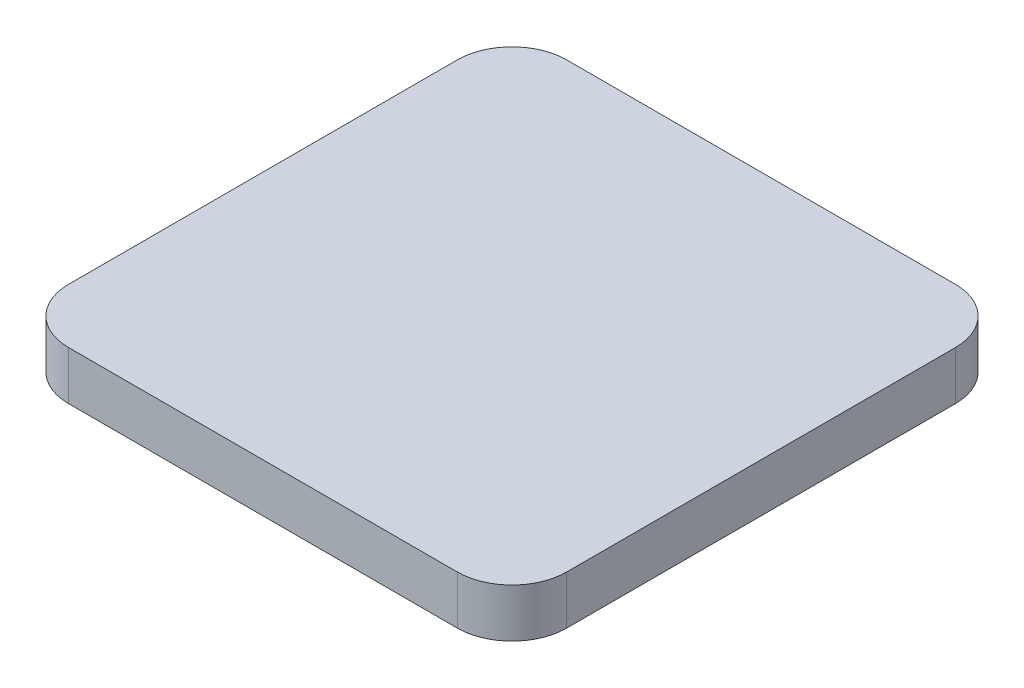
ISO-10303-21;
HEADER;
FILE_DESCRIPTION(('STEP AP214'),'2;1');
FILE_NAME('part.step','',(''),(''),'','','');
FILE_SCHEMA(('AUTOMOTIVE_DESIGN { 1 0 10303 214 1 1 1 1 }'));
ENDSEC;
DATA;
#1=APPLICATION_CONTEXT('core data for automotive mechanical design processes');
#2=APPLICATION_PROTOCOL_DEFINITION('international standard','automotive_design',2000,#1);
#3=PRODUCT_CONTEXT('',#1,'mechanical');
#4=PRODUCT('Part','Part','',(#3));
#5=PRODUCT_RELATED_PRODUCT_CATEGORY('part','',(#4));
#6=PRODUCT_DEFINITION_FORMATION('','',#4);
#7=PRODUCT_DEFINITION_CONTEXT('part definition',#1,'design');
#8=PRODUCT_DEFINITION('design','',#6,#7);
#9=PRODUCT_DEFINITION_SHAPE('','',#8);
#10=(LENGTH_UNIT() NAMED_UNIT(*) SI_UNIT(.MILLI.,.METRE.));
#11=(NAMED_UNIT(*) PLANE_ANGLE_UNIT() SI_UNIT($,.RADIAN.));
#12=(NAMED_UNIT(*) SI_UNIT($,.STERADIAN.) SOLID_ANGLE_UNIT());
#13=UNCERTAINTY_MEASURE_WITH_UNIT(LENGTH_MEASURE(1.E-05),#10,'distance_accuracy_value','');
#14=(GEOMETRIC_REPRESENTATION_CONTEXT(3) GLOBAL_UNCERTAINTY_ASSIGNED_CONTEXT((#13)) GLOBAL_UNIT_ASSIGNED_CONTEXT((#10,
#11,#12)) REPRESENTATION_CONTEXT('',''));
#15=CARTESIAN_POINT('',(0.,0.,0.));
#16=DIRECTION('',(0.,0.,1.));
#17=DIRECTION('',(1.,0.,0.));
#18=AXIS2_PLACEMENT_3D('',#15,#16,#17);
#19=CARTESIAN_POINT('',(16.,4.,-16.));
#20=DIRECTION('',(0.,-1.,0.));
#21=DIRECTION('',(0.,0.,-1.));
#22=AXIS2_PLACEMENT_3D('',#19,#20,#21);
#23=CYLINDRICAL_SURFACE('',#22,4.50000000000001);
#24=CARTESIAN_POINT('',(16.,0.,-16.));
#25=DIRECTION('',(0.,1.,0.));
#26=DIRECTION('',(0.,0.,-1.));
#27=AXIS2_PLACEMENT_3D('',#24,#25,#26);
#28=CIRCLE('',#27,4.50000000000001);
#29=CARTESIAN_POINT('',(20.5,0.,-16.));
#30=VERTEX_POINT('',#29);
#31=CARTESIAN_POINT('',(16.,0.,-20.5));
#32=VERTEX_POINT('',#31);
#33=EDGE_CURVE('E134',#30,#32,#28,.T.);
#34=ORIENTED_EDGE('',*,*,#33,.T.);
#35=DIRECTION('',(0.,-1.,0.));
#36=VECTOR('',#35,1.);
#37=CARTESIAN_POINT('',(16.,4.,-20.5));
#38=LINE('',#37,#36);
#39=CARTESIAN_POINT('',(16.,4.,-20.5));
#40=VERTEX_POINT('',#39);
#41=EDGE_CURVE('E11',#40,#32,#38,.T.);
#42=ORIENTED_EDGE('',*,*,#41,.F.);
#43=CARTESIAN_POINT('',(16.,4.,-16.));
#44=DIRECTION('',(0.,1.,0.));
#45=DIRECTION('',(0.,0.,-1.));
#46=AXIS2_PLACEMENT_3D('',#43,#44,#45);
#47=CIRCLE('',#46,4.50000000000001);
#48=CARTESIAN_POINT('',(20.5,4.,-16.));
#49=VERTEX_POINT('',#48);
#50=EDGE_CURVE('E146',#49,#40,#47,.T.);
#51=ORIENTED_EDGE('',*,*,#50,.F.);
#52=DIRECTION('',(0.,-1.,0.));
#53=VECTOR('',#52,1.);
#54=CARTESIAN_POINT('',(20.5,4.,-16.));
#55=LINE('',#54,#53);
#56=EDGE_CURVE('E131',#49,#30,#55,.T.);
#57=ORIENTED_EDGE('',*,*,#56,.T.);
#58=EDGE_LOOP('',(#34,#42,#51,#57));
#59=FACE_BOUND('',#58,.T.);
#60=ADVANCED_FACE('F39',(#59),#23,.T.);
#61=CARTESIAN_POINT('',(-16.,4.,-20.5));
#62=DIRECTION('',(0.,0.,1.));
#63=DIRECTION('',(1.,0.,0.));
#64=AXIS2_PLACEMENT_3D('',#61,#62,#63);
#65=PLANE('',#64);
#66=DIRECTION('',(-1.,0.,0.));
#67=VECTOR('',#66,1.);
#68=CARTESIAN_POINT('',(-16.,0.,-20.5));
#69=LINE('',#68,#67);
#70=CARTESIAN_POINT('',(-16.,0.,-20.5));
#71=VERTEX_POINT('',#70);
#72=EDGE_CURVE('E138',#32,#71,#69,.T.);
#73=ORIENTED_EDGE('',*,*,#72,.T.);
#74=DIRECTION('',(0.,-1.,0.));
#75=VECTOR('',#74,1.);
#76=CARTESIAN_POINT('',(-16.,4.,-20.5));
#77=LINE('',#76,#75);
#78=CARTESIAN_POINT('',(-16.,4.,-20.5));
#79=VERTEX_POINT('',#78);
#80=EDGE_CURVE('E50',#79,#71,#77,.T.);
#81=ORIENTED_EDGE('',*,*,#80,.F.);
#82=DIRECTION('',(-1.,0.,0.));
#83=VECTOR('',#82,1.);
#84=CARTESIAN_POINT('',(-16.,4.,-20.5));
#85=LINE('',#84,#83);
#86=EDGE_CURVE('E97',#40,#79,#85,.T.);
#87=ORIENTED_EDGE('',*,*,#86,.F.);
#88=ORIENTED_EDGE('',*,*,#41,.T.);
#89=EDGE_LOOP('',(#73,#81,#87,#88));
#90=FACE_BOUND('',#89,.T.);
#91=ADVANCED_FACE('F182',(#90),#65,.F.);
#92=CARTESIAN_POINT('',(-16.,4.,-16.));
#93=DIRECTION('',(0.,-1.,0.));
#94=DIRECTION('',(0.,0.,-1.));
#95=AXIS2_PLACEMENT_3D('',#92,#93,#94);
#96=CYLINDRICAL_SURFACE('',#95,4.50000000000001);
#97=CARTESIAN_POINT('',(-16.,0.,-16.));
#98=DIRECTION('',(0.,1.,0.));
#99=DIRECTION('',(0.,0.,-1.));
#100=AXIS2_PLACEMENT_3D('',#97,#98,#99);
#101=CIRCLE('',#100,4.50000000000001);
#102=CARTESIAN_POINT('',(-20.5,0.,-16.));
#103=VERTEX_POINT('',#102);
#104=EDGE_CURVE('E139',#71,#103,#101,.T.);
#105=ORIENTED_EDGE('',*,*,#104,.T.);
#106=DIRECTION('',(0.,-1.,0.));
#107=VECTOR('',#106,1.);
#108=CARTESIAN_POINT('',(-20.5,4.,-16.));
#109=LINE('',#108,#107);
#110=CARTESIAN_POINT('',(-20.5,4.,-16.));
#111=VERTEX_POINT('',#110);
#112=EDGE_CURVE('E157',#111,#103,#109,.T.);
#113=ORIENTED_EDGE('',*,*,#112,.F.);
#114=CARTESIAN_POINT('',(-16.,4.,-16.));
#115=DIRECTION('',(0.,1.,0.));
#116=DIRECTION('',(0.,0.,-1.));
#117=AXIS2_PLACEMENT_3D('',#114,#115,#116);
#118=CIRCLE('',#117,4.50000000000001);
#119=EDGE_CURVE('E161',#79,#111,#118,.T.);
#120=ORIENTED_EDGE('',*,*,#119,.F.);
#121=ORIENTED_EDGE('',*,*,#80,.T.);
#122=EDGE_LOOP('',(#105,#113,#120,#121));
#123=FACE_BOUND('',#122,.T.);
#124=ADVANCED_FACE('F164',(#123),#96,.T.);
#125=CARTESIAN_POINT('',(-20.5,4.,16.));
#126=DIRECTION('',(1.,0.,0.));
#127=DIRECTION('',(0.,0.,-1.));
#128=AXIS2_PLACEMENT_3D('',#125,#126,#127);
#129=PLANE('',#128);
#130=DIRECTION('',(0.,0.,1.));
#131=VECTOR('',#130,1.);
#132=CARTESIAN_POINT('',(-20.5,0.,16.));
#133=LINE('',#132,#131);
#134=CARTESIAN_POINT('',(-20.5,0.,16.));
#135=VERTEX_POINT('',#134);
#136=EDGE_CURVE('E145',#103,#135,#133,.T.);
#137=ORIENTED_EDGE('',*,*,#136,.T.);
#138=DIRECTION('',(0.,-1.,0.));
#139=VECTOR('',#138,1.);
#140=CARTESIAN_POINT('',(-20.5,4.,16.));
#141=LINE('',#140,#139);
#142=CARTESIAN_POINT('',(-20.5,4.,16.));
#143=VERTEX_POINT('',#142);
#144=EDGE_CURVE('E155',#143,#135,#141,.T.);
#145=ORIENTED_EDGE('',*,*,#144,.F.);
#146=DIRECTION('',(0.,0.,1.));
#147=VECTOR('',#146,1.);
#148=CARTESIAN_POINT('',(-20.5,4.,16.));
#149=LINE('',#148,#147);
#150=EDGE_CURVE('E176',#111,#143,#149,.T.);
#151=ORIENTED_EDGE('',*,*,#150,.F.);
#152=ORIENTED_EDGE('',*,*,#112,.T.);
#153=EDGE_LOOP('',(#137,#145,#151,#152));
#154=FACE_BOUND('',#153,.T.);
#155=ADVANCED_FACE('F175',(#154),#129,.F.);
#156=CARTESIAN_POINT('',(-16.,4.,16.));
#157=DIRECTION('',(0.,-1.,0.));
#158=DIRECTION('',(0.,0.,-1.));
#159=AXIS2_PLACEMENT_3D('',#156,#157,#158);
#160=CYLINDRICAL_SURFACE('',#159,4.50000000000001);
#161=CARTESIAN_POINT('',(-16.,0.,16.));
#162=DIRECTION('',(0.,1.,0.));
#163=DIRECTION('',(0.,0.,-1.));
#164=AXIS2_PLACEMENT_3D('',#161,#162,#163);
#165=CIRCLE('',#164,4.50000000000001);
#166=CARTESIAN_POINT('',(-16.,0.,20.5));
#167=VERTEX_POINT('',#166);
#168=EDGE_CURVE('E143',#135,#167,#165,.T.);
#169=ORIENTED_EDGE('',*,*,#168,.T.);
#170=DIRECTION('',(0.,-1.,0.));
#171=VECTOR('',#170,1.);
#172=CARTESIAN_POINT('',(-16.,4.,20.5));
#173=LINE('',#172,#171);
#174=CARTESIAN_POINT('',(-16.,4.,20.5));
#175=VERTEX_POINT('',#174);
#176=EDGE_CURVE('E128',#175,#167,#173,.T.);
#177=ORIENTED_EDGE('',*,*,#176,.F.);
#178=CARTESIAN_POINT('',(-16.,4.,16.));
#179=DIRECTION('',(0.,1.,0.));
#180=DIRECTION('',(0.,0.,-1.));
#181=AXIS2_PLACEMENT_3D('',#178,#179,#180);
#182=CIRCLE('',#181,4.50000000000001);
#183=EDGE_CURVE('E119',#143,#175,#182,.T.);
#184=ORIENTED_EDGE('',*,*,#183,.F.);
#185=ORIENTED_EDGE('',*,*,#144,.T.);
#186=EDGE_LOOP('',(#169,#177,#184,#185));
#187=FACE_BOUND('',#186,.T.);
#188=ADVANCED_FACE('F172',(#187),#160,.T.);
#189=CARTESIAN_POINT('',(16.,4.,20.5));
#190=DIRECTION('',(0.,0.,-1.));
#191=DIRECTION('',(-1.,0.,0.));
#192=AXIS2_PLACEMENT_3D('',#189,#190,#191);
#193=PLANE('',#192);
#194=DIRECTION('',(1.,0.,0.));
#195=VECTOR('',#194,1.);
#196=CARTESIAN_POINT('',(16.,0.,20.5));
#197=LINE('',#196,#195);
#198=CARTESIAN_POINT('',(16.,0.,20.5));
#199=VERTEX_POINT('',#198);
#200=EDGE_CURVE('E124',#167,#199,#197,.T.);
#201=ORIENTED_EDGE('',*,*,#200,.T.);
#202=DIRECTION('',(0.,-1.,0.));
#203=VECTOR('',#202,1.);
#204=CARTESIAN_POINT('',(16.,4.,20.5));
#205=LINE('',#204,#203);
#206=CARTESIAN_POINT('',(16.,4.,20.5));
#207=VERTEX_POINT('',#206);
#208=EDGE_CURVE('E122',#207,#199,#205,.T.);
#209=ORIENTED_EDGE('',*,*,#208,.F.);
#210=DIRECTION('',(1.,0.,0.));
#211=VECTOR('',#210,1.);
#212=CARTESIAN_POINT('',(16.,4.,20.5));
#213=LINE('',#212,#211);
#214=EDGE_CURVE('E112',#175,#207,#213,.T.);
#215=ORIENTED_EDGE('',*,*,#214,.F.);
#216=ORIENTED_EDGE('',*,*,#176,.T.);
#217=EDGE_LOOP('',(#201,#209,#215,#216));
#218=FACE_BOUND('',#217,.T.);
#219=ADVANCED_FACE('F121',(#218),#193,.F.);
#220=CARTESIAN_POINT('',(16.,4.,16.));
#221=DIRECTION('',(0.,-1.,0.));
#222=DIRECTION('',(0.,0.,-1.));
#223=AXIS2_PLACEMENT_3D('',#220,#221,#222);
#224=CYLINDRICAL_SURFACE('',#223,4.50000000000001);
#225=CARTESIAN_POINT('',(16.,0.,16.));
#226=DIRECTION('',(0.,1.,0.));
#227=DIRECTION('',(0.,0.,-1.));
#228=AXIS2_PLACEMENT_3D('',#225,#226,#227);
#229=CIRCLE('',#228,4.50000000000001);
#230=CARTESIAN_POINT('',(20.5,0.,16.));
#231=VERTEX_POINT('',#230);
#232=EDGE_CURVE('E84',#199,#231,#229,.T.);
#233=ORIENTED_EDGE('',*,*,#232,.T.);
#234=DIRECTION('',(0.,-1.,0.));
#235=VECTOR('',#234,1.);
#236=CARTESIAN_POINT('',(20.5,4.,16.));
#237=LINE('',#236,#235);
#238=CARTESIAN_POINT('',(20.5,4.,16.));
#239=VERTEX_POINT('',#238);
#240=EDGE_CURVE('E130',#239,#231,#237,.T.);
#241=ORIENTED_EDGE('',*,*,#240,.F.);
#242=CARTESIAN_POINT('',(16.,4.,16.));
#243=DIRECTION('',(0.,1.,0.));
#244=DIRECTION('',(0.,0.,-1.));
#245=AXIS2_PLACEMENT_3D('',#242,#243,#244);
#246=CIRCLE('',#245,4.50000000000001);
#247=EDGE_CURVE('E113',#207,#239,#246,.T.);
#248=ORIENTED_EDGE('',*,*,#247,.F.);
#249=ORIENTED_EDGE('',*,*,#208,.T.);
#250=EDGE_LOOP('',(#233,#241,#248,#249));
#251=FACE_BOUND('',#250,.T.);
#252=ADVANCED_FACE('F129',(#251),#224,.T.);
#253=CARTESIAN_POINT('',(20.5,4.,-16.));
#254=DIRECTION('',(-1.,0.,0.));
#255=DIRECTION('',(0.,0.,1.));
#256=AXIS2_PLACEMENT_3D('',#253,#254,#255);
#257=PLANE('',#256);
#258=DIRECTION('',(0.,0.,-1.));
#259=VECTOR('',#258,1.);
#260=CARTESIAN_POINT('',(20.5,0.,-16.));
#261=LINE('',#260,#259);
#262=EDGE_CURVE('E89',#231,#30,#261,.T.);
#263=ORIENTED_EDGE('',*,*,#262,.T.);
#264=ORIENTED_EDGE('',*,*,#56,.F.);
#265=DIRECTION('',(0.,0.,-1.));
#266=VECTOR('',#265,1.);
#267=CARTESIAN_POINT('',(20.5,4.,-16.));
#268=LINE('',#267,#266);
#269=EDGE_CURVE('E54',#239,#49,#268,.T.);
#270=ORIENTED_EDGE('',*,*,#269,.F.);
#271=ORIENTED_EDGE('',*,*,#240,.T.);
#272=EDGE_LOOP('',(#263,#264,#270,#271));
#273=FACE_BOUND('',#272,.T.);
#274=ADVANCED_FACE('F198',(#273),#257,.F.);
#275=CARTESIAN_POINT('',(16.,4.,-16.));
#276=DIRECTION('',(0.,-1.,0.));
#277=DIRECTION('',(0.,0.,-1.));
#278=AXIS2_PLACEMENT_3D('',#275,#276,#277);
#279=PLANE('',#278);
#280=ORIENTED_EDGE('',*,*,#50,.T.);
#281=ORIENTED_EDGE('',*,*,#86,.T.);
#282=ORIENTED_EDGE('',*,*,#119,.T.);
#283=ORIENTED_EDGE('',*,*,#150,.T.);
#284=ORIENTED_EDGE('',*,*,#183,.T.);
#285=ORIENTED_EDGE('',*,*,#214,.T.);
#286=ORIENTED_EDGE('',*,*,#247,.T.);
#287=ORIENTED_EDGE('',*,*,#269,.T.);
#288=EDGE_LOOP('',(#280,#281,#282,#283,#284,#285,#286,#287));
#289=FACE_BOUND('',#288,.T.);
#290=ADVANCED_FACE('F111',(#289),#279,.F.);
#291=CARTESIAN_POINT('',(16.,0.,-16.));
#292=DIRECTION('',(0.,-1.,0.));
#293=DIRECTION('',(0.,0.,-1.));
#294=AXIS2_PLACEMENT_3D('',#291,#292,#293);
#295=PLANE('',#294);
#296=ORIENTED_EDGE('',*,*,#33,.F.);
#297=ORIENTED_EDGE('',*,*,#262,.F.);
#298=ORIENTED_EDGE('',*,*,#232,.F.);
#299=ORIENTED_EDGE('',*,*,#200,.F.);
#300=ORIENTED_EDGE('',*,*,#168,.F.);
#301=ORIENTED_EDGE('',*,*,#136,.F.);
#302=ORIENTED_EDGE('',*,*,#104,.F.);
#303=ORIENTED_EDGE('',*,*,#72,.F.);
#304=EDGE_LOOP('',(#296,#297,#298,#299,#300,#301,#302,#303));
#305=FACE_BOUND('',#304,.T.);
#306=ADVANCED_FACE('F166',(#305),#295,.T.);
#307=CLOSED_SHELL('',(#60,#91,#124,#155,#188,#219,#252,#274,#290,#306));
#308=MANIFOLD_SOLID_BREP('B2',#307);
#309=ADVANCED_BREP_SHAPE_REPRESENTATION('',(#18,#308),#14);
#310=SHAPE_DEFINITION_REPRESENTATION(#9,#309);
ENDSEC;
END-ISO-10303-21;
